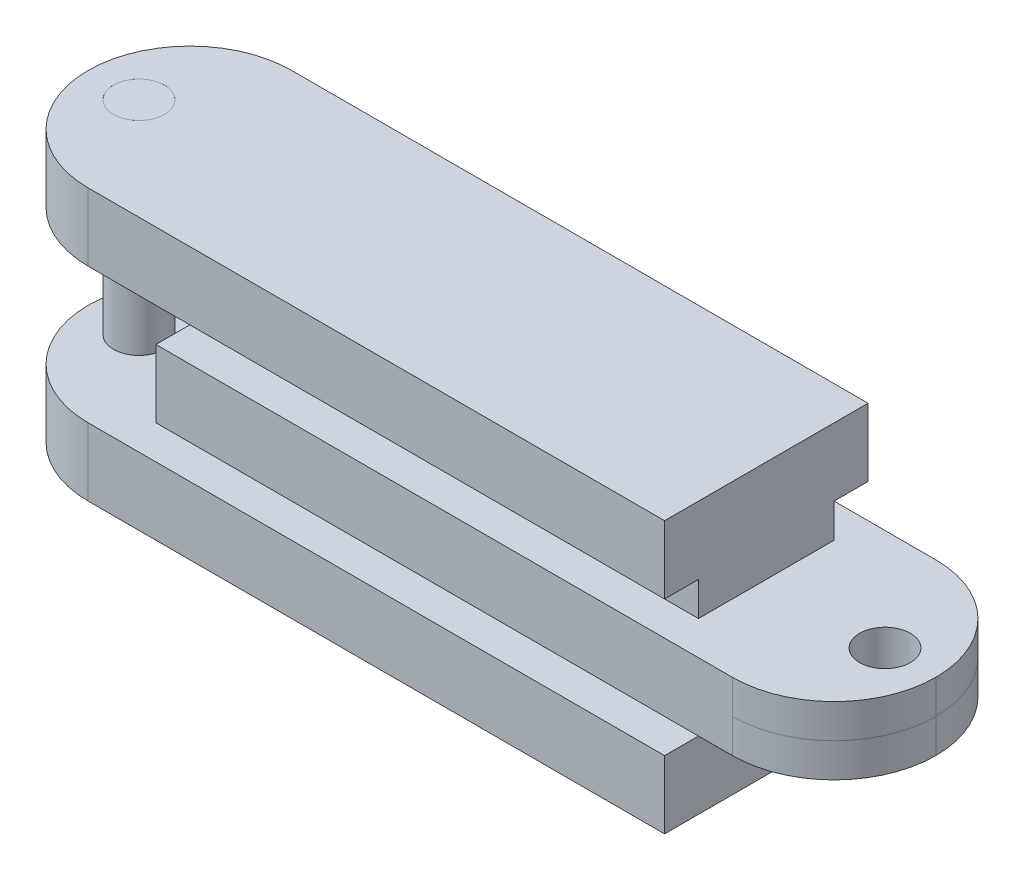
ISO-10303-21;
HEADER;
FILE_DESCRIPTION(('STEP AP214'),'2;1');
FILE_NAME('part.step','',(''),(''),'','','');
FILE_SCHEMA(('AUTOMOTIVE_DESIGN { 1 0 10303 214 1 1 1 1 }'));
ENDSEC;
DATA;
#1=APPLICATION_CONTEXT('core data for automotive mechanical design processes');
#2=APPLICATION_PROTOCOL_DEFINITION('international standard','automotive_design',2000,#1);
#3=PRODUCT_CONTEXT('',#1,'mechanical');
#4=PRODUCT('Part','Part','',(#3));
#5=PRODUCT_RELATED_PRODUCT_CATEGORY('part','',(#4));
#6=PRODUCT_DEFINITION_FORMATION('','',#4);
#7=PRODUCT_DEFINITION_CONTEXT('part definition',#1,'design');
#8=PRODUCT_DEFINITION('design','',#6,#7);
#9=PRODUCT_DEFINITION_SHAPE('','',#8);
#10=(LENGTH_UNIT() NAMED_UNIT(*) SI_UNIT(.MILLI.,.METRE.));
#11=(NAMED_UNIT(*) PLANE_ANGLE_UNIT() SI_UNIT($,.RADIAN.));
#12=(NAMED_UNIT(*) SI_UNIT($,.STERADIAN.) SOLID_ANGLE_UNIT());
#13=UNCERTAINTY_MEASURE_WITH_UNIT(LENGTH_MEASURE(1.E-05),#10,'distance_accuracy_value','');
#14=(GEOMETRIC_REPRESENTATION_CONTEXT(3) GLOBAL_UNCERTAINTY_ASSIGNED_CONTEXT((#13)) GLOBAL_UNIT_ASSIGNED_CONTEXT((#10,
#11,#12)) REPRESENTATION_CONTEXT('',''));
#15=CARTESIAN_POINT('',(0.,0.,0.));
#16=DIRECTION('',(0.,0.,1.));
#17=DIRECTION('',(1.,0.,0.));
#18=AXIS2_PLACEMENT_3D('',#15,#16,#17);
#19=CARTESIAN_POINT('',(-85.,0.,0.));
#20=DIRECTION('',(0.,1.,0.));
#21=DIRECTION('',(-1.,0.,0.));
#22=AXIS2_PLACEMENT_3D('',#19,#20,#21);
#23=CYLINDRICAL_SURFACE('',#22,7.50000000000001);
#24=CARTESIAN_POINT('',(-85.,0.,0.));
#25=DIRECTION('',(0.,1.,0.));
#26=DIRECTION('',(-1.,0.,0.));
#27=AXIS2_PLACEMENT_3D('',#24,#25,#26);
#28=CIRCLE('',#27,7.50000000000001);
#29=CARTESIAN_POINT('',(-92.5,0.,0.));
#30=VERTEX_POINT('',#29);
#31=EDGE_CURVE('E11',#30,#30,#28,.T.);
#32=ORIENTED_EDGE('',*,*,#31,.T.);
#33=EDGE_LOOP('',(#32));
#34=FACE_BOUND('',#33,.T.);
#35=CARTESIAN_POINT('',(-85.,80.,0.));
#36=DIRECTION('',(0.,1.,0.));
#37=DIRECTION('',(-1.,0.,0.));
#38=AXIS2_PLACEMENT_3D('',#35,#36,#37);
#39=CIRCLE('',#38,7.50000000000001);
#40=CARTESIAN_POINT('',(-92.5,80.,0.));
#41=VERTEX_POINT('',#40);
#42=EDGE_CURVE('E52',#41,#41,#39,.T.);
#43=ORIENTED_EDGE('',*,*,#42,.F.);
#44=EDGE_LOOP('',(#43));
#45=FACE_BOUND('',#44,.T.);
#46=ADVANCED_FACE('F46',(#34,#45),#23,.T.);
#47=CARTESIAN_POINT('',(-85.,0.,0.));
#48=DIRECTION('',(0.,1.,0.));
#49=DIRECTION('',(-1.,0.,0.));
#50=AXIS2_PLACEMENT_3D('',#47,#48,#49);
#51=PLANE('',#50);
#52=ORIENTED_EDGE('',*,*,#31,.F.);
#53=EDGE_LOOP('',(#52));
#54=FACE_BOUND('',#53,.T.);
#55=ADVANCED_FACE('F61',(#54),#51,.F.);
#56=CARTESIAN_POINT('',(-85.,80.,0.));
#57=DIRECTION('',(0.,1.,0.));
#58=DIRECTION('',(-1.,0.,0.));
#59=AXIS2_PLACEMENT_3D('',#56,#57,#58);
#60=PLANE('',#59);
#61=ORIENTED_EDGE('',*,*,#42,.T.);
#62=EDGE_LOOP('',(#61));
#63=FACE_BOUND('',#62,.T.);
#64=ADVANCED_FACE('F58',(#63),#60,.T.);
#65=CLOSED_SHELL('',(#46,#55,#64));
#66=MANIFOLD_SOLID_BREP('B2',#65);
#67=CARTESIAN_POINT('',(0.,0.,30.));
#68=DIRECTION('',(0.,0.,-1.));
#69=DIRECTION('',(-1.,0.,0.));
#70=AXIS2_PLACEMENT_3D('',#67,#68,#69);
#71=PLANE('',#70);
#72=DIRECTION('',(0.,-1.,0.));
#73=VECTOR('',#72,1.);
#74=CARTESIAN_POINT('',(-50.,20.,30.));
#75=LINE('',#74,#73);
#76=CARTESIAN_POINT('',(-50.,50.,30.));
#77=VERTEX_POINT('',#76);
#78=CARTESIAN_POINT('',(-50.,30.,30.));
#79=VERTEX_POINT('',#78);
#80=EDGE_CURVE('E411',#77,#79,#75,.T.);
#81=ORIENTED_EDGE('',*,*,#80,.T.);
#82=DIRECTION('',(1.,0.,0.));
#83=VECTOR('',#82,1.);
#84=CARTESIAN_POINT('',(150.,30.,30.));
#85=LINE('',#84,#83);
#86=CARTESIAN_POINT('',(120.,30.,30.));
#87=VERTEX_POINT('',#86);
#88=EDGE_CURVE('E408',#79,#87,#85,.T.);
#89=ORIENTED_EDGE('',*,*,#88,.T.);
#90=DIRECTION('',(0.,1.,0.));
#91=VECTOR('',#90,1.);
#92=CARTESIAN_POINT('',(120.,40.,30.));
#93=LINE('',#92,#91);
#94=CARTESIAN_POINT('',(120.,40.,30.));
#95=VERTEX_POINT('',#94);
#96=EDGE_CURVE('E275',#87,#95,#93,.T.);
#97=ORIENTED_EDGE('',*,*,#96,.T.);
#98=DIRECTION('',(0.,-1.,0.));
#99=VECTOR('',#98,1.);
#100=CARTESIAN_POINT('',(120.,0.,30.));
#101=LINE('',#100,#99);
#102=CARTESIAN_POINT('',(120.,50.,30.));
#103=VERTEX_POINT('',#102);
#104=EDGE_CURVE('E329',#95,#103,#101,.F.);
#105=ORIENTED_EDGE('',*,*,#104,.T.);
#106=DIRECTION('',(1.,0.,0.));
#107=VECTOR('',#106,1.);
#108=CARTESIAN_POINT('',(150.,50.,30.));
#109=LINE('',#108,#107);
#110=EDGE_CURVE('E368',#77,#103,#109,.T.);
#111=ORIENTED_EDGE('',*,*,#110,.F.);
#112=EDGE_LOOP('',(#81,#89,#97,#105,#111));
#113=FACE_BOUND('',#112,.T.);
#114=ADVANCED_FACE('F86',(#113),#71,.F.);
#115=DIRECTION('',(-1.,0.,0.));
#116=VECTOR('',#115,1.);
#117=CARTESIAN_POINT('',(-100.,60.,30.));
#118=LINE('',#117,#116);
#119=CARTESIAN_POINT('',(100.,60.,30.));
#120=VERTEX_POINT('',#119);
#121=CARTESIAN_POINT('',(-70.,60.,30.));
#122=VERTEX_POINT('',#121);
#123=EDGE_CURVE('E356',#120,#122,#118,.T.);
#124=ORIENTED_EDGE('',*,*,#123,.F.);
#125=DIRECTION('',(0.,-1.,0.));
#126=VECTOR('',#125,1.);
#127=CARTESIAN_POINT('',(100.,50.,30.));
#128=LINE('',#127,#126);
#129=CARTESIAN_POINT('',(100.,80.,30.));
#130=VERTEX_POINT('',#129);
#131=EDGE_CURVE('E388',#130,#120,#128,.T.);
#132=ORIENTED_EDGE('',*,*,#131,.F.);
#133=DIRECTION('',(1.,0.,0.));
#134=VECTOR('',#133,1.);
#135=CARTESIAN_POINT('',(100.,80.,30.));
#136=LINE('',#135,#134);
#137=CARTESIAN_POINT('',(-70.,80.,30.));
#138=VERTEX_POINT('',#137);
#139=EDGE_CURVE('E358',#138,#130,#136,.T.);
#140=ORIENTED_EDGE('',*,*,#139,.F.);
#141=DIRECTION('',(0.,1.,0.));
#142=VECTOR('',#141,1.);
#143=CARTESIAN_POINT('',(-70.,0.,30.));
#144=LINE('',#143,#142);
#145=EDGE_CURVE('E94',#138,#122,#144,.F.);
#146=ORIENTED_EDGE('',*,*,#145,.T.);
#147=EDGE_LOOP('',(#124,#132,#140,#146));
#148=FACE_BOUND('',#147,.T.);
#149=ADVANCED_FACE('F354',(#148),#71,.F.);
#150=CARTESIAN_POINT('',(0.,0.,-30.));
#151=DIRECTION('',(0.,0.,-1.));
#152=DIRECTION('',(-1.,0.,0.));
#153=AXIS2_PLACEMENT_3D('',#150,#151,#152);
#154=PLANE('',#153);
#155=DIRECTION('',(0.,-1.,0.));
#156=VECTOR('',#155,1.);
#157=CARTESIAN_POINT('',(-50.,20.,-30.));
#158=LINE('',#157,#156);
#159=CARTESIAN_POINT('',(-50.,50.,-30.));
#160=VERTEX_POINT('',#159);
#161=CARTESIAN_POINT('',(-50.,30.,-30.));
#162=VERTEX_POINT('',#161);
#163=EDGE_CURVE('E424',#160,#162,#158,.T.);
#164=ORIENTED_EDGE('',*,*,#163,.F.);
#165=DIRECTION('',(1.,0.,0.));
#166=VECTOR('',#165,1.);
#167=CARTESIAN_POINT('',(150.,50.,-30.));
#168=LINE('',#167,#166);
#169=CARTESIAN_POINT('',(120.,50.,-30.));
#170=VERTEX_POINT('',#169);
#171=EDGE_CURVE('E383',#160,#170,#168,.T.);
#172=ORIENTED_EDGE('',*,*,#171,.T.);
#173=DIRECTION('',(0.,-1.,0.));
#174=VECTOR('',#173,1.);
#175=CARTESIAN_POINT('',(120.,40.,-30.));
#176=LINE('',#175,#174);
#177=CARTESIAN_POINT('',(120.,40.,-30.));
#178=VERTEX_POINT('',#177);
#179=EDGE_CURVE('E333',#170,#178,#176,.T.);
#180=ORIENTED_EDGE('',*,*,#179,.T.);
#181=DIRECTION('',(0.,1.,0.));
#182=VECTOR('',#181,1.);
#183=CARTESIAN_POINT('',(120.,0.,-30.));
#184=LINE('',#183,#182);
#185=CARTESIAN_POINT('',(120.,30.,-30.));
#186=VERTEX_POINT('',#185);
#187=EDGE_CURVE('E303',#178,#186,#184,.F.);
#188=ORIENTED_EDGE('',*,*,#187,.T.);
#189=DIRECTION('',(1.,0.,0.));
#190=VECTOR('',#189,1.);
#191=CARTESIAN_POINT('',(150.,30.,-30.));
#192=LINE('',#191,#190);
#193=EDGE_CURVE('E422',#162,#186,#192,.T.);
#194=ORIENTED_EDGE('',*,*,#193,.F.);
#195=EDGE_LOOP('',(#164,#172,#180,#188,#194));
#196=FACE_BOUND('',#195,.T.);
#197=ADVANCED_FACE('F531',(#196),#154,.T.);
#198=DIRECTION('',(-1.,0.,0.));
#199=VECTOR('',#198,1.);
#200=CARTESIAN_POINT('',(-100.,20.,-30.));
#201=LINE('',#200,#199);
#202=CARTESIAN_POINT('',(100.,20.,-30.));
#203=VERTEX_POINT('',#202);
#204=CARTESIAN_POINT('',(-70.,20.,-30.));
#205=VERTEX_POINT('',#204);
#206=EDGE_CURVE('E285',#203,#205,#201,.T.);
#207=ORIENTED_EDGE('',*,*,#206,.F.);
#208=DIRECTION('',(0.,1.,0.));
#209=VECTOR('',#208,1.);
#210=CARTESIAN_POINT('',(100.,30.,-30.));
#211=LINE('',#210,#209);
#212=CARTESIAN_POINT('',(100.,0.,-30.));
#213=VERTEX_POINT('',#212);
#214=EDGE_CURVE('E419',#213,#203,#211,.T.);
#215=ORIENTED_EDGE('',*,*,#214,.F.);
#216=DIRECTION('',(1.,0.,0.));
#217=VECTOR('',#216,1.);
#218=CARTESIAN_POINT('',(100.,0.,-30.));
#219=LINE('',#218,#217);
#220=CARTESIAN_POINT('',(-70.,0.,-30.));
#221=VERTEX_POINT('',#220);
#222=EDGE_CURVE('E417',#221,#213,#219,.T.);
#223=ORIENTED_EDGE('',*,*,#222,.F.);
#224=DIRECTION('',(0.,-1.,0.));
#225=VECTOR('',#224,1.);
#226=CARTESIAN_POINT('',(-70.,0.,-30.));
#227=LINE('',#226,#225);
#228=EDGE_CURVE('E315',#221,#205,#227,.F.);
#229=ORIENTED_EDGE('',*,*,#228,.T.);
#230=EDGE_LOOP('',(#207,#215,#223,#229));
#231=FACE_BOUND('',#230,.T.);
#232=ADVANCED_FACE('F544',(#231),#154,.T.);
#233=CARTESIAN_POINT('',(100.,0.,-30.));
#234=DIRECTION('',(0.,-1.,0.));
#235=DIRECTION('',(1.,0.,0.));
#236=AXIS2_PLACEMENT_3D('',#233,#234,#235);
#237=PLANE('',#236);
#238=CARTESIAN_POINT('',(-85.,0.,0.));
#239=DIRECTION('',(0.,1.,0.));
#240=DIRECTION('',(0.,0.,1.));
#241=AXIS2_PLACEMENT_3D('',#238,#239,#240);
#242=CIRCLE('',#241,7.50000000000001);
#243=CARTESIAN_POINT('',(-85.,0.,7.50000000000001));
#244=VERTEX_POINT('',#243);
#245=EDGE_CURVE('E310',#244,#244,#242,.T.);
#246=ORIENTED_EDGE('',*,*,#245,.T.);
#247=EDGE_LOOP('',(#246));
#248=FACE_BOUND('',#247,.T.);
#249=DIRECTION('',(1.,0.,0.));
#250=VECTOR('',#249,1.);
#251=CARTESIAN_POINT('',(100.,0.,30.));
#252=LINE('',#251,#250);
#253=CARTESIAN_POINT('',(-70.,0.,30.));
#254=VERTEX_POINT('',#253);
#255=CARTESIAN_POINT('',(100.,0.,30.));
#256=VERTEX_POINT('',#255);
#257=EDGE_CURVE('E292',#254,#256,#252,.T.);
#258=ORIENTED_EDGE('',*,*,#257,.F.);
#259=CARTESIAN_POINT('',(-70.,0.,0.));
#260=DIRECTION('',(0.,-1.,0.));
#261=DIRECTION('',(1.,0.,0.));
#262=AXIS2_PLACEMENT_3D('',#259,#260,#261);
#263=CIRCLE('',#262,30.);
#264=CARTESIAN_POINT('',(-100.,0.,0.));
#265=VERTEX_POINT('',#264);
#266=EDGE_CURVE('E322',#254,#265,#263,.T.);
#267=ORIENTED_EDGE('',*,*,#266,.T.);
#268=CARTESIAN_POINT('',(-70.,0.,0.));
#269=DIRECTION('',(0.,-1.,0.));
#270=DIRECTION('',(1.,0.,0.));
#271=AXIS2_PLACEMENT_3D('',#268,#269,#270);
#272=CIRCLE('',#271,30.);
#273=EDGE_CURVE('E313',#265,#221,#272,.T.);
#274=ORIENTED_EDGE('',*,*,#273,.T.);
#275=ORIENTED_EDGE('',*,*,#222,.T.);
#276=DIRECTION('',(0.,0.,1.));
#277=VECTOR('',#276,1.);
#278=CARTESIAN_POINT('',(100.,0.,-30.));
#279=LINE('',#278,#277);
#280=EDGE_CURVE('E282',#213,#256,#279,.T.);
#281=ORIENTED_EDGE('',*,*,#280,.T.);
#282=EDGE_LOOP('',(#258,#267,#274,#275,#281));
#283=FACE_BOUND('',#282,.T.);
#284=ADVANCED_FACE('F554',(#248,#283),#237,.T.);
#285=CARTESIAN_POINT('',(-100.,20.,-30.));
#286=DIRECTION('',(0.,1.,0.));
#287=DIRECTION('',(-1.,0.,0.));
#288=AXIS2_PLACEMENT_3D('',#285,#286,#287);
#289=PLANE('',#288);
#290=CARTESIAN_POINT('',(-85.,20.,0.));
#291=DIRECTION('',(0.,1.,0.));
#292=DIRECTION('',(-1.,0.,0.));
#293=AXIS2_PLACEMENT_3D('',#290,#291,#292);
#294=CIRCLE('',#293,7.50000000000001);
#295=CARTESIAN_POINT('',(-92.5,20.,0.));
#296=VERTEX_POINT('',#295);
#297=EDGE_CURVE('E293',#296,#296,#294,.T.);
#298=ORIENTED_EDGE('',*,*,#297,.F.);
#299=EDGE_LOOP('',(#298));
#300=FACE_BOUND('',#299,.T.);
#301=CARTESIAN_POINT('',(-70.,20.,0.));
#302=DIRECTION('',(0.,1.,0.));
#303=DIRECTION('',(-1.,0.,0.));
#304=AXIS2_PLACEMENT_3D('',#301,#302,#303);
#305=CIRCLE('',#304,30.);
#306=CARTESIAN_POINT('',(-100.,20.,0.));
#307=VERTEX_POINT('',#306);
#308=EDGE_CURVE('E317',#205,#307,#305,.T.);
#309=ORIENTED_EDGE('',*,*,#308,.T.);
#310=CARTESIAN_POINT('',(-70.,20.,0.));
#311=DIRECTION('',(0.,1.,0.));
#312=DIRECTION('',(-1.,0.,0.));
#313=AXIS2_PLACEMENT_3D('',#310,#311,#312);
#314=CIRCLE('',#313,30.);
#315=CARTESIAN_POINT('',(-70.,20.,30.));
#316=VERTEX_POINT('',#315);
#317=EDGE_CURVE('E324',#307,#316,#314,.T.);
#318=ORIENTED_EDGE('',*,*,#317,.T.);
#319=DIRECTION('',(-1.,0.,0.));
#320=VECTOR('',#319,1.);
#321=CARTESIAN_POINT('',(-100.,20.,30.));
#322=LINE('',#321,#320);
#323=CARTESIAN_POINT('',(100.,20.,30.));
#324=VERTEX_POINT('',#323);
#325=EDGE_CURVE('E414',#324,#316,#322,.T.);
#326=ORIENTED_EDGE('',*,*,#325,.F.);
#327=DIRECTION('',(0.,0.,1.));
#328=VECTOR('',#327,1.);
#329=CARTESIAN_POINT('',(100.,20.,20.));
#330=LINE('',#329,#328);
#331=CARTESIAN_POINT('',(100.,20.,20.));
#332=VERTEX_POINT('',#331);
#333=EDGE_CURVE('E256',#332,#324,#330,.T.);
#334=ORIENTED_EDGE('',*,*,#333,.F.);
#335=DIRECTION('',(1.,0.,0.));
#336=VECTOR('',#335,1.);
#337=CARTESIAN_POINT('',(-50.,20.,20.));
#338=LINE('',#337,#336);
#339=CARTESIAN_POINT('',(-50.,20.,20.));
#340=VERTEX_POINT('',#339);
#341=EDGE_CURVE('E249',#340,#332,#338,.T.);
#342=ORIENTED_EDGE('',*,*,#341,.F.);
#343=DIRECTION('',(0.,0.,1.));
#344=VECTOR('',#343,1.);
#345=CARTESIAN_POINT('',(-50.,20.,-30.));
#346=LINE('',#345,#344);
#347=CARTESIAN_POINT('',(-50.,20.,-20.));
#348=VERTEX_POINT('',#347);
#349=EDGE_CURVE('E254',#348,#340,#346,.T.);
#350=ORIENTED_EDGE('',*,*,#349,.F.);
#351=DIRECTION('',(-1.,0.,0.));
#352=VECTOR('',#351,1.);
#353=CARTESIAN_POINT('',(-50.,20.,-20.));
#354=LINE('',#353,#352);
#355=CARTESIAN_POINT('',(100.,20.,-20.));
#356=VERTEX_POINT('',#355);
#357=EDGE_CURVE('E484',#356,#348,#354,.T.);
#358=ORIENTED_EDGE('',*,*,#357,.F.);
#359=DIRECTION('',(0.,0.,-1.));
#360=VECTOR('',#359,1.);
#361=CARTESIAN_POINT('',(100.,20.,-20.));
#362=LINE('',#361,#360);
#363=EDGE_CURVE('E433',#356,#203,#362,.T.);
#364=ORIENTED_EDGE('',*,*,#363,.T.);
#365=ORIENTED_EDGE('',*,*,#206,.T.);
#366=EDGE_LOOP('',(#309,#318,#326,#334,#342,#350,#358,#364,#365));
#367=FACE_BOUND('',#366,.T.);
#368=ADVANCED_FACE('F251',(#300,#367),#289,.T.);
#369=CARTESIAN_POINT('',(-50.,20.,-30.));
#370=DIRECTION('',(-1.,0.,0.));
#371=DIRECTION('',(0.,0.,1.));
#372=AXIS2_PLACEMENT_3D('',#369,#370,#371);
#373=PLANE('',#372);
#374=DIRECTION('',(0.,0.,1.));
#375=VECTOR('',#374,1.);
#376=CARTESIAN_POINT('',(-50.,30.,20.));
#377=LINE('',#376,#375);
#378=CARTESIAN_POINT('',(-50.,30.,20.));
#379=VERTEX_POINT('',#378);
#380=EDGE_CURVE('E451',#379,#79,#377,.T.);
#381=ORIENTED_EDGE('',*,*,#380,.T.);
#382=ORIENTED_EDGE('',*,*,#80,.F.);
#383=DIRECTION('',(0.,0.,1.));
#384=VECTOR('',#383,1.);
#385=CARTESIAN_POINT('',(-50.,50.,20.));
#386=LINE('',#385,#384);
#387=CARTESIAN_POINT('',(-50.,50.,20.));
#388=VERTEX_POINT('',#387);
#389=EDGE_CURVE('E463',#388,#77,#386,.T.);
#390=ORIENTED_EDGE('',*,*,#389,.F.);
#391=DIRECTION('',(0.,-1.,0.));
#392=VECTOR('',#391,1.);
#393=CARTESIAN_POINT('',(-50.,60.,20.));
#394=LINE('',#393,#392);
#395=CARTESIAN_POINT('',(-50.,60.,20.));
#396=VERTEX_POINT('',#395);
#397=EDGE_CURVE('E453',#396,#388,#394,.T.);
#398=ORIENTED_EDGE('',*,*,#397,.F.);
#399=DIRECTION('',(0.,0.,1.));
#400=VECTOR('',#399,1.);
#401=CARTESIAN_POINT('',(-50.,60.,-30.));
#402=LINE('',#401,#400);
#403=CARTESIAN_POINT('',(-50.,60.,-20.));
#404=VERTEX_POINT('',#403);
#405=EDGE_CURVE('E393',#404,#396,#402,.T.);
#406=ORIENTED_EDGE('',*,*,#405,.F.);
#407=DIRECTION('',(0.,1.,0.));
#408=VECTOR('',#407,1.);
#409=CARTESIAN_POINT('',(-50.,60.,-20.));
#410=LINE('',#409,#408);
#411=CARTESIAN_POINT('',(-50.,50.,-20.));
#412=VERTEX_POINT('',#411);
#413=EDGE_CURVE('E465',#412,#404,#410,.T.);
#414=ORIENTED_EDGE('',*,*,#413,.F.);
#415=DIRECTION('',(0.,0.,-1.));
#416=VECTOR('',#415,1.);
#417=CARTESIAN_POINT('',(-50.,50.,-20.));
#418=LINE('',#417,#416);
#419=EDGE_CURVE('E476',#412,#160,#418,.T.);
#420=ORIENTED_EDGE('',*,*,#419,.T.);
#421=ORIENTED_EDGE('',*,*,#163,.T.);
#422=DIRECTION('',(0.,0.,-1.));
#423=VECTOR('',#422,1.);
#424=CARTESIAN_POINT('',(-50.,30.,-20.));
#425=LINE('',#424,#423);
#426=CARTESIAN_POINT('',(-50.,30.,-20.));
#427=VERTEX_POINT('',#426);
#428=EDGE_CURVE('E486',#427,#162,#425,.T.);
#429=ORIENTED_EDGE('',*,*,#428,.F.);
#430=DIRECTION('',(0.,1.,0.));
#431=VECTOR('',#430,1.);
#432=CARTESIAN_POINT('',(-50.,20.,-20.));
#433=LINE('',#432,#431);
#434=EDGE_CURVE('E274',#348,#427,#433,.T.);
#435=ORIENTED_EDGE('',*,*,#434,.F.);
#436=ORIENTED_EDGE('',*,*,#349,.T.);
#437=DIRECTION('',(0.,-1.,0.));
#438=VECTOR('',#437,1.);
#439=CARTESIAN_POINT('',(-50.,20.,20.));
#440=LINE('',#439,#438);
#441=EDGE_CURVE('E260',#379,#340,#440,.T.);
#442=ORIENTED_EDGE('',*,*,#441,.F.);
#443=EDGE_LOOP('',(#381,#382,#390,#398,#406,#414,#420,#421,#429,#435,#436,#442));
#444=FACE_BOUND('',#443,.T.);
#445=ADVANCED_FACE('F271',(#444),#373,.T.);
#446=CARTESIAN_POINT('',(150.,30.,-30.));
#447=DIRECTION('',(0.,-1.,0.));
#448=DIRECTION('',(1.,0.,0.));
#449=AXIS2_PLACEMENT_3D('',#446,#447,#448);
#450=PLANE('',#449);
#451=CARTESIAN_POINT('',(135.,30.,0.));
#452=DIRECTION('',(0.,-1.,0.));
#453=DIRECTION('',(1.,0.,0.));
#454=AXIS2_PLACEMENT_3D('',#451,#452,#453);
#455=CIRCLE('',#454,7.50000000000001);
#456=CARTESIAN_POINT('',(127.5,30.,0.));
#457=VERTEX_POINT('',#456);
#458=EDGE_CURVE('E290',#457,#457,#455,.T.);
#459=ORIENTED_EDGE('',*,*,#458,.F.);
#460=EDGE_LOOP('',(#459));
#461=FACE_BOUND('',#460,.T.);
#462=ORIENTED_EDGE('',*,*,#193,.T.);
#463=CARTESIAN_POINT('',(120.,30.,0.));
#464=DIRECTION('',(0.,-1.,0.));
#465=DIRECTION('',(1.,0.,0.));
#466=AXIS2_PLACEMENT_3D('',#463,#464,#465);
#467=CIRCLE('',#466,30.);
#468=CARTESIAN_POINT('',(150.,30.,0.));
#469=VERTEX_POINT('',#468);
#470=EDGE_CURVE('E305',#186,#469,#467,.T.);
#471=ORIENTED_EDGE('',*,*,#470,.T.);
#472=CARTESIAN_POINT('',(120.,30.,0.));
#473=DIRECTION('',(0.,-1.,0.));
#474=DIRECTION('',(1.,0.,0.));
#475=AXIS2_PLACEMENT_3D('',#472,#473,#474);
#476=CIRCLE('',#475,30.);
#477=EDGE_CURVE('E299',#469,#87,#476,.T.);
#478=ORIENTED_EDGE('',*,*,#477,.T.);
#479=ORIENTED_EDGE('',*,*,#88,.F.);
#480=ORIENTED_EDGE('',*,*,#380,.F.);
#481=DIRECTION('',(-1.,0.,0.));
#482=VECTOR('',#481,1.);
#483=CARTESIAN_POINT('',(-50.,30.,20.));
#484=LINE('',#483,#482);
#485=CARTESIAN_POINT('',(100.,30.,20.));
#486=VERTEX_POINT('',#485);
#487=EDGE_CURVE('E266',#486,#379,#484,.T.);
#488=ORIENTED_EDGE('',*,*,#487,.F.);
#489=DIRECTION('',(0.,0.,1.));
#490=VECTOR('',#489,1.);
#491=CARTESIAN_POINT('',(100.,30.,-30.));
#492=LINE('',#491,#490);
#493=CARTESIAN_POINT('',(100.,30.,-20.));
#494=VERTEX_POINT('',#493);
#495=EDGE_CURVE('E276',#494,#486,#492,.T.);
#496=ORIENTED_EDGE('',*,*,#495,.F.);
#497=DIRECTION('',(1.,0.,0.));
#498=VECTOR('',#497,1.);
#499=CARTESIAN_POINT('',(-50.,30.,-20.));
#500=LINE('',#499,#498);
#501=EDGE_CURVE('E480',#427,#494,#500,.T.);
#502=ORIENTED_EDGE('',*,*,#501,.F.);
#503=ORIENTED_EDGE('',*,*,#428,.T.);
#504=EDGE_LOOP('',(#462,#471,#478,#479,#480,#488,#496,#502,#503));
#505=FACE_BOUND('',#504,.T.);
#506=ADVANCED_FACE('F549',(#461,#505),#450,.T.);
#507=CARTESIAN_POINT('',(100.,30.,-30.));
#508=DIRECTION('',(1.,0.,0.));
#509=DIRECTION('',(0.,0.,-1.));
#510=AXIS2_PLACEMENT_3D('',#507,#508,#509);
#511=PLANE('',#510);
#512=ORIENTED_EDGE('',*,*,#333,.T.);
#513=DIRECTION('',(0.,1.,0.));
#514=VECTOR('',#513,1.);
#515=CARTESIAN_POINT('',(100.,30.,30.));
#516=LINE('',#515,#514);
#517=EDGE_CURVE('E405',#256,#324,#516,.T.);
#518=ORIENTED_EDGE('',*,*,#517,.F.);
#519=ORIENTED_EDGE('',*,*,#280,.F.);
#520=ORIENTED_EDGE('',*,*,#214,.T.);
#521=ORIENTED_EDGE('',*,*,#363,.F.);
#522=DIRECTION('',(0.,-1.,0.));
#523=VECTOR('',#522,1.);
#524=CARTESIAN_POINT('',(100.,20.,-20.));
#525=LINE('',#524,#523);
#526=EDGE_CURVE('E482',#494,#356,#525,.T.);
#527=ORIENTED_EDGE('',*,*,#526,.F.);
#528=ORIENTED_EDGE('',*,*,#495,.T.);
#529=DIRECTION('',(0.,1.,0.));
#530=VECTOR('',#529,1.);
#531=CARTESIAN_POINT('',(100.,20.,20.));
#532=LINE('',#531,#530);
#533=EDGE_CURVE('E259',#332,#486,#532,.T.);
#534=ORIENTED_EDGE('',*,*,#533,.F.);
#535=EDGE_LOOP('',(#512,#518,#519,#520,#521,#527,#528,#534));
#536=FACE_BOUND('',#535,.T.);
#537=ADVANCED_FACE('F450',(#536),#511,.T.);
#538=DIRECTION('',(0.,-1.,0.));
#539=VECTOR('',#538,1.);
#540=CARTESIAN_POINT('',(100.,50.,-30.));
#541=LINE('',#540,#539);
#542=CARTESIAN_POINT('',(100.,80.,-30.));
#543=VERTEX_POINT('',#542);
#544=CARTESIAN_POINT('',(100.,60.,-30.));
#545=VERTEX_POINT('',#544);
#546=EDGE_CURVE('E382',#543,#545,#541,.T.);
#547=ORIENTED_EDGE('',*,*,#546,.T.);
#548=DIRECTION('',(-1.,0.,0.));
#549=VECTOR('',#548,1.);
#550=CARTESIAN_POINT('',(-100.,60.,-30.));
#551=LINE('',#550,#549);
#552=CARTESIAN_POINT('',(-70.,60.,-30.));
#553=VERTEX_POINT('',#552);
#554=EDGE_CURVE('E375',#545,#553,#551,.T.);
#555=ORIENTED_EDGE('',*,*,#554,.T.);
#556=DIRECTION('',(0.,1.,0.));
#557=VECTOR('',#556,1.);
#558=CARTESIAN_POINT('',(-70.,80.,-30.));
#559=LINE('',#558,#557);
#560=CARTESIAN_POINT('',(-70.,80.,-30.));
#561=VERTEX_POINT('',#560);
#562=EDGE_CURVE('E338',#553,#561,#559,.T.);
#563=ORIENTED_EDGE('',*,*,#562,.T.);
#564=DIRECTION('',(1.,0.,0.));
#565=VECTOR('',#564,1.);
#566=CARTESIAN_POINT('',(100.,80.,-30.));
#567=LINE('',#566,#565);
#568=EDGE_CURVE('E384',#561,#543,#567,.T.);
#569=ORIENTED_EDGE('',*,*,#568,.T.);
#570=EDGE_LOOP('',(#547,#555,#563,#569));
#571=FACE_BOUND('',#570,.T.);
#572=ADVANCED_FACE('F379',(#571),#154,.T.);
#573=ORIENTED_EDGE('',*,*,#517,.T.);
#574=ORIENTED_EDGE('',*,*,#325,.T.);
#575=DIRECTION('',(0.,-1.,0.));
#576=VECTOR('',#575,1.);
#577=CARTESIAN_POINT('',(-70.,0.,30.));
#578=LINE('',#577,#576);
#579=EDGE_CURVE('E319',#316,#254,#578,.T.);
#580=ORIENTED_EDGE('',*,*,#579,.T.);
#581=ORIENTED_EDGE('',*,*,#257,.T.);
#582=EDGE_LOOP('',(#573,#574,#580,#581));
#583=FACE_BOUND('',#582,.T.);
#584=ADVANCED_FACE('F445',(#583),#71,.F.);
#585=CARTESIAN_POINT('',(135.,0.,0.));
#586=DIRECTION('',(0.,1.,0.));
#587=DIRECTION('',(-1.,0.,0.));
#588=AXIS2_PLACEMENT_3D('',#585,#586,#587);
#589=CYLINDRICAL_SURFACE('',#588,7.50000000000001);
#590=CARTESIAN_POINT('',(135.,50.,0.));
#591=DIRECTION('',(0.,-1.,0.));
#592=DIRECTION('',(1.,0.,0.));
#593=AXIS2_PLACEMENT_3D('',#590,#591,#592);
#594=CIRCLE('',#593,7.50000000000001);
#595=CARTESIAN_POINT('',(127.5,50.,0.));
#596=VERTEX_POINT('',#595);
#597=EDGE_CURVE('E496',#596,#596,#594,.F.);
#598=CARTESIAN_POINT('',(127.5,30.,0.));
#599=CARTESIAN_POINT('',(127.5,30.2083333333333,0.));
#600=CARTESIAN_POINT('',(127.5,30.4166666666667,0.));
#601=CARTESIAN_POINT('',(127.5,30.8333333333333,0.));
#602=CARTESIAN_POINT('',(127.5,31.0416666666667,0.));
#603=CARTESIAN_POINT('',(127.5,31.4583333333333,0.));
#604=CARTESIAN_POINT('',(127.5,31.6666666666667,0.));
#605=CARTESIAN_POINT('',(127.5,32.0833333333333,0.));
#606=CARTESIAN_POINT('',(127.5,32.2916666666667,0.));
#607=CARTESIAN_POINT('',(127.5,32.7083333333333,0.));
#608=CARTESIAN_POINT('',(127.5,32.9166666666667,0.));
#609=CARTESIAN_POINT('',(127.5,33.3333333333333,0.));
#610=CARTESIAN_POINT('',(127.5,33.5416666666667,0.));
#611=CARTESIAN_POINT('',(127.5,33.9583333333333,0.));
#612=CARTESIAN_POINT('',(127.5,34.1666666666667,0.));
#613=CARTESIAN_POINT('',(127.5,34.5833333333333,0.));
#614=CARTESIAN_POINT('',(127.5,34.7916666666667,0.));
#615=CARTESIAN_POINT('',(127.5,35.2083333333333,0.));
#616=CARTESIAN_POINT('',(127.5,35.4166666666667,0.));
#617=CARTESIAN_POINT('',(127.5,35.8333333333333,0.));
#618=CARTESIAN_POINT('',(127.5,36.0416666666667,0.));
#619=CARTESIAN_POINT('',(127.5,36.4583333333333,0.));
#620=CARTESIAN_POINT('',(127.5,36.6666666666667,0.));
#621=CARTESIAN_POINT('',(127.5,37.0833333333333,0.));
#622=CARTESIAN_POINT('',(127.5,37.2916666666667,0.));
#623=CARTESIAN_POINT('',(127.5,37.7083333333333,0.));
#624=CARTESIAN_POINT('',(127.5,37.9166666666667,0.));
#625=CARTESIAN_POINT('',(127.5,38.3333333333333,0.));
#626=CARTESIAN_POINT('',(127.5,38.5416666666667,0.));
#627=CARTESIAN_POINT('',(127.5,38.9583333333333,0.));
#628=CARTESIAN_POINT('',(127.5,39.1666666666667,0.));
#629=CARTESIAN_POINT('',(127.5,39.5833333333333,0.));
#630=CARTESIAN_POINT('',(127.5,39.7916666666667,0.));
#631=CARTESIAN_POINT('',(127.5,40.2083333333333,0.));
#632=CARTESIAN_POINT('',(127.5,40.4166666666667,0.));
#633=CARTESIAN_POINT('',(127.5,40.8333333333333,0.));
#634=CARTESIAN_POINT('',(127.5,41.0416666666667,0.));
#635=CARTESIAN_POINT('',(127.5,41.4583333333333,0.));
#636=CARTESIAN_POINT('',(127.5,41.6666666666667,0.));
#637=CARTESIAN_POINT('',(127.5,42.0833333333333,0.));
#638=CARTESIAN_POINT('',(127.5,42.2916666666667,0.));
#639=CARTESIAN_POINT('',(127.5,42.7083333333333,0.));
#640=CARTESIAN_POINT('',(127.5,42.9166666666667,0.));
#641=CARTESIAN_POINT('',(127.5,43.3333333333333,0.));
#642=CARTESIAN_POINT('',(127.5,43.5416666666667,0.));
#643=CARTESIAN_POINT('',(127.5,43.9583333333333,0.));
#644=CARTESIAN_POINT('',(127.5,44.1666666666667,0.));
#645=CARTESIAN_POINT('',(127.5,44.5833333333333,0.));
#646=CARTESIAN_POINT('',(127.5,44.7916666666667,0.));
#647=CARTESIAN_POINT('',(127.5,45.2083333333333,0.));
#648=CARTESIAN_POINT('',(127.5,45.4166666666667,0.));
#649=CARTESIAN_POINT('',(127.5,45.8333333333333,0.));
#650=CARTESIAN_POINT('',(127.5,46.0416666666667,0.));
#651=CARTESIAN_POINT('',(127.5,46.4583333333333,0.));
#652=CARTESIAN_POINT('',(127.5,46.6666666666667,0.));
#653=CARTESIAN_POINT('',(127.5,47.0833333333333,0.));
#654=CARTESIAN_POINT('',(127.5,47.2916666666667,0.));
#655=CARTESIAN_POINT('',(127.5,47.7083333333333,0.));
#656=CARTESIAN_POINT('',(127.5,47.9166666666667,0.));
#657=CARTESIAN_POINT('',(127.5,48.3333333333333,0.));
#658=CARTESIAN_POINT('',(127.5,48.5416666666667,0.));
#659=CARTESIAN_POINT('',(127.5,48.9583333333333,0.));
#660=CARTESIAN_POINT('',(127.5,49.1666666666667,0.));
#661=CARTESIAN_POINT('',(127.5,49.5833333333333,0.));
#662=CARTESIAN_POINT('',(127.5,49.7916666666667,0.));
#663=CARTESIAN_POINT('',(127.5,50.,0.));
#664=B_SPLINE_CURVE_WITH_KNOTS('',3,(#598,#599,#600,#601,#602,#603,#604,#605,#606,#607,#608,
#609,#610,#611,#612,#613,#614,#615,#616,#617,#618,#619,#620,#621,#622,#623,#624,#625,#626,#627,
#628,#629,#630,#631,#632,#633,#634,#635,#636,#637,#638,#639,#640,#641,#642,#643,#644,#645,#646,
#647,#648,#649,#650,#651,#652,#653,#654,#655,#656,#657,#658,#659,#660,#661,#662,#663),
.UNSPECIFIED.,.F.,.F.,(4,2,2,2,2,2,2,2,2,2,2,2,2,2,2,2,2,2,2,2,2,2,2,2,2,2,2,2,2,2,2,2,4),(0.,
0.625000000000001,1.25,1.875,2.5,3.12499999999999,3.74999999999999,4.37499999999999,
4.99999999999999,5.62499999999999,6.25,6.875,7.5,8.125,8.75,9.375,10.,10.625,11.25,11.875,12.5,
13.125,13.75,14.375,15.,15.625,16.25,16.875,17.5,18.125,18.75,19.375,20.),.UNSPECIFIED.);
#665=EDGE_CURVE('BSEAM535',#457,#596,#664,.T.);
#666=ORIENTED_EDGE('',*,*,#458,.T.);
#667=ORIENTED_EDGE('',*,*,#597,.T.);
#668=ORIENTED_EDGE('',*,*,#665,.T.);
#669=ORIENTED_EDGE('',*,*,#665,.F.);
#670=EDGE_LOOP('',(#666,#668,#667,#669));
#671=FACE_BOUND('',#670,.T.);
#672=ADVANCED_FACE('F535',(#671),#589,.F.);
#673=CARTESIAN_POINT('',(120.,0.,0.));
#674=DIRECTION('',(0.,-1.,0.));
#675=DIRECTION('',(0.,0.,-1.));
#676=AXIS2_PLACEMENT_3D('',#673,#674,#675);
#677=CYLINDRICAL_SURFACE('',#676,30.);
#678=ORIENTED_EDGE('',*,*,#477,.F.);
#679=DIRECTION('',(0.,1.,0.));
#680=VECTOR('',#679,1.);
#681=CARTESIAN_POINT('',(150.,30.,0.));
#682=LINE('',#681,#680);
#683=CARTESIAN_POINT('',(150.,40.,0.));
#684=VERTEX_POINT('',#683);
#685=EDGE_CURVE('E296',#684,#469,#682,.F.);
#686=ORIENTED_EDGE('',*,*,#685,.F.);
#687=CARTESIAN_POINT('',(120.,40.,0.));
#688=DIRECTION('',(0.,1.,0.));
#689=DIRECTION('',(-1.,0.,0.));
#690=AXIS2_PLACEMENT_3D('',#687,#688,#689);
#691=CIRCLE('',#690,30.);
#692=EDGE_CURVE('E279',#95,#684,#691,.T.);
#693=ORIENTED_EDGE('',*,*,#692,.F.);
#694=ORIENTED_EDGE('',*,*,#96,.F.);
#695=EDGE_LOOP('',(#678,#686,#693,#694));
#696=FACE_BOUND('',#695,.T.);
#697=ADVANCED_FACE('F541',(#696),#677,.T.);
#698=CARTESIAN_POINT('',(120.,40.,0.));
#699=DIRECTION('',(0.,1.,0.));
#700=DIRECTION('',(0.,0.,1.));
#701=AXIS2_PLACEMENT_3D('',#698,#699,#700);
#702=CYLINDRICAL_SURFACE('',#701,30.);
#703=ORIENTED_EDGE('',*,*,#470,.F.);
#704=ORIENTED_EDGE('',*,*,#187,.F.);
#705=CARTESIAN_POINT('',(120.,40.,0.));
#706=DIRECTION('',(0.,1.,0.));
#707=DIRECTION('',(-1.,0.,0.));
#708=AXIS2_PLACEMENT_3D('',#705,#706,#707);
#709=CIRCLE('',#708,30.);
#710=EDGE_CURVE('E301',#684,#178,#709,.T.);
#711=ORIENTED_EDGE('',*,*,#710,.F.);
#712=ORIENTED_EDGE('',*,*,#685,.T.);
#713=EDGE_LOOP('',(#703,#704,#711,#712));
#714=FACE_BOUND('',#713,.T.);
#715=ADVANCED_FACE('F572',(#714),#702,.T.);
#716=CARTESIAN_POINT('',(-85.,0.,0.));
#717=DIRECTION('',(0.,1.,0.));
#718=DIRECTION('',(0.,0.,1.));
#719=AXIS2_PLACEMENT_3D('',#716,#717,#718);
#720=CYLINDRICAL_SURFACE('',#719,7.50000000000001);
#721=ORIENTED_EDGE('',*,*,#297,.T.);
#722=EDGE_LOOP('',(#721));
#723=FACE_BOUND('',#722,.T.);
#724=ORIENTED_EDGE('',*,*,#245,.F.);
#725=EDGE_LOOP('',(#724));
#726=FACE_BOUND('',#725,.T.);
#727=ADVANCED_FACE('F576',(#723,#726),#720,.F.);
#728=CARTESIAN_POINT('',(-70.,0.,0.));
#729=DIRECTION('',(0.,-1.,0.));
#730=DIRECTION('',(0.,0.,-1.));
#731=AXIS2_PLACEMENT_3D('',#728,#729,#730);
#732=CYLINDRICAL_SURFACE('',#731,30.);
#733=ORIENTED_EDGE('',*,*,#308,.F.);
#734=ORIENTED_EDGE('',*,*,#228,.F.);
#735=ORIENTED_EDGE('',*,*,#273,.F.);
#736=DIRECTION('',(0.,-1.,0.));
#737=VECTOR('',#736,1.);
#738=CARTESIAN_POINT('',(-100.,0.,0.));
#739=LINE('',#738,#737);
#740=EDGE_CURVE('E307',#307,#265,#739,.T.);
#741=ORIENTED_EDGE('',*,*,#740,.F.);
#742=EDGE_LOOP('',(#733,#734,#735,#741));
#743=FACE_BOUND('',#742,.T.);
#744=ADVANCED_FACE('F438',(#743),#732,.T.);
#745=CARTESIAN_POINT('',(-70.,0.,0.));
#746=DIRECTION('',(0.,1.,0.));
#747=DIRECTION('',(0.,0.,1.));
#748=AXIS2_PLACEMENT_3D('',#745,#746,#747);
#749=CYLINDRICAL_SURFACE('',#748,30.);
#750=ORIENTED_EDGE('',*,*,#317,.F.);
#751=ORIENTED_EDGE('',*,*,#740,.T.);
#752=ORIENTED_EDGE('',*,*,#266,.F.);
#753=ORIENTED_EDGE('',*,*,#579,.F.);
#754=EDGE_LOOP('',(#750,#751,#752,#753));
#755=FACE_BOUND('',#754,.T.);
#756=ADVANCED_FACE('F443',(#755),#749,.T.);
#757=CARTESIAN_POINT('',(-100.,60.,-30.));
#758=DIRECTION('',(0.,1.,0.));
#759=DIRECTION('',(-1.,0.,0.));
#760=AXIS2_PLACEMENT_3D('',#757,#758,#759);
#761=PLANE('',#760);
#762=CARTESIAN_POINT('',(-85.,60.,0.));
#763=DIRECTION('',(0.,1.,0.));
#764=DIRECTION('',(-1.,0.,0.));
#765=AXIS2_PLACEMENT_3D('',#762,#763,#764);
#766=CIRCLE('',#765,7.50000000000001);
#767=CARTESIAN_POINT('',(-92.5,60.,0.));
#768=VERTEX_POINT('',#767);
#769=EDGE_CURVE('E493',#768,#768,#766,.F.);
#770=ORIENTED_EDGE('',*,*,#769,.F.);
#771=EDGE_LOOP('',(#770));
#772=FACE_BOUND('',#771,.T.);
#773=ORIENTED_EDGE('',*,*,#123,.T.);
#774=CARTESIAN_POINT('',(-70.,60.,0.));
#775=DIRECTION('',(0.,1.,0.));
#776=DIRECTION('',(-1.,0.,0.));
#777=AXIS2_PLACEMENT_3D('',#774,#775,#776);
#778=CIRCLE('',#777,30.);
#779=CARTESIAN_POINT('',(-100.,60.,0.));
#780=VERTEX_POINT('',#779);
#781=EDGE_CURVE('E44',#122,#780,#778,.F.);
#782=ORIENTED_EDGE('',*,*,#781,.T.);
#783=CARTESIAN_POINT('',(-70.,60.,0.));
#784=DIRECTION('',(0.,1.,0.));
#785=DIRECTION('',(-1.,0.,0.));
#786=AXIS2_PLACEMENT_3D('',#783,#784,#785);
#787=CIRCLE('',#786,30.);
#788=EDGE_CURVE('E347',#780,#553,#787,.F.);
#789=ORIENTED_EDGE('',*,*,#788,.T.);
#790=ORIENTED_EDGE('',*,*,#554,.F.);
#791=DIRECTION('',(0.,0.,-1.));
#792=VECTOR('',#791,1.);
#793=CARTESIAN_POINT('',(100.,60.,-20.));
#794=LINE('',#793,#792);
#795=CARTESIAN_POINT('',(100.,60.,-20.));
#796=VERTEX_POINT('',#795);
#797=EDGE_CURVE('E475',#796,#545,#794,.T.);
#798=ORIENTED_EDGE('',*,*,#797,.F.);
#799=DIRECTION('',(1.,0.,0.));
#800=VECTOR('',#799,1.);
#801=CARTESIAN_POINT('',(-50.,60.,-20.));
#802=LINE('',#801,#800);
#803=EDGE_CURVE('E109',#404,#796,#802,.T.);
#804=ORIENTED_EDGE('',*,*,#803,.F.);
#805=ORIENTED_EDGE('',*,*,#405,.T.);
#806=DIRECTION('',(-1.,0.,0.));
#807=VECTOR('',#806,1.);
#808=CARTESIAN_POINT('',(-50.,60.,20.));
#809=LINE('',#808,#807);
#810=CARTESIAN_POINT('',(100.,60.,20.));
#811=VERTEX_POINT('',#810);
#812=EDGE_CURVE('E461',#811,#396,#809,.T.);
#813=ORIENTED_EDGE('',*,*,#812,.F.);
#814=DIRECTION('',(0.,0.,1.));
#815=VECTOR('',#814,1.);
#816=CARTESIAN_POINT('',(100.,60.,20.));
#817=LINE('',#816,#815);
#818=EDGE_CURVE('E366',#811,#120,#817,.T.);
#819=ORIENTED_EDGE('',*,*,#818,.T.);
#820=EDGE_LOOP('',(#773,#782,#789,#790,#798,#804,#805,#813,#819));
#821=FACE_BOUND('',#820,.T.);
#822=ADVANCED_FACE('F362',(#772,#821),#761,.F.);
#823=CARTESIAN_POINT('',(150.,50.,-30.));
#824=DIRECTION('',(0.,-1.,0.));
#825=DIRECTION('',(1.,0.,0.));
#826=AXIS2_PLACEMENT_3D('',#823,#824,#825);
#827=PLANE('',#826);
#828=ORIENTED_EDGE('',*,*,#597,.F.);
#829=EDGE_LOOP('',(#828));
#830=FACE_BOUND('',#829,.T.);
#831=CARTESIAN_POINT('',(120.,50.,0.));
#832=DIRECTION('',(0.,-1.,0.));
#833=DIRECTION('',(1.,0.,0.));
#834=AXIS2_PLACEMENT_3D('',#831,#832,#833);
#835=CIRCLE('',#834,30.);
#836=CARTESIAN_POINT('',(150.,50.,0.));
#837=VERTEX_POINT('',#836);
#838=EDGE_CURVE('E331',#103,#837,#835,.F.);
#839=ORIENTED_EDGE('',*,*,#838,.T.);
#840=CARTESIAN_POINT('',(120.,50.,0.));
#841=DIRECTION('',(0.,-1.,0.));
#842=DIRECTION('',(1.,0.,0.));
#843=AXIS2_PLACEMENT_3D('',#840,#841,#842);
#844=CIRCLE('',#843,30.);
#845=EDGE_CURVE('E336',#837,#170,#844,.F.);
#846=ORIENTED_EDGE('',*,*,#845,.T.);
#847=ORIENTED_EDGE('',*,*,#171,.F.);
#848=ORIENTED_EDGE('',*,*,#419,.F.);
#849=DIRECTION('',(-1.,0.,0.));
#850=VECTOR('',#849,1.);
#851=CARTESIAN_POINT('',(-50.,50.,-20.));
#852=LINE('',#851,#850);
#853=CARTESIAN_POINT('',(100.,50.,-20.));
#854=VERTEX_POINT('',#853);
#855=EDGE_CURVE('E472',#854,#412,#852,.T.);
#856=ORIENTED_EDGE('',*,*,#855,.F.);
#857=DIRECTION('',(0.,0.,1.));
#858=VECTOR('',#857,1.);
#859=CARTESIAN_POINT('',(100.,50.,-30.));
#860=LINE('',#859,#858);
#861=CARTESIAN_POINT('',(100.,50.,20.));
#862=VERTEX_POINT('',#861);
#863=EDGE_CURVE('E397',#854,#862,#860,.T.);
#864=ORIENTED_EDGE('',*,*,#863,.T.);
#865=DIRECTION('',(1.,0.,0.));
#866=VECTOR('',#865,1.);
#867=CARTESIAN_POINT('',(-50.,50.,20.));
#868=LINE('',#867,#866);
#869=EDGE_CURVE('E101',#388,#862,#868,.T.);
#870=ORIENTED_EDGE('',*,*,#869,.F.);
#871=ORIENTED_EDGE('',*,*,#389,.T.);
#872=ORIENTED_EDGE('',*,*,#110,.T.);
#873=EDGE_LOOP('',(#839,#846,#847,#848,#856,#864,#870,#871,#872));
#874=FACE_BOUND('',#873,.T.);
#875=ADVANCED_FACE('F518',(#830,#874),#827,.F.);
#876=CARTESIAN_POINT('',(100.,50.,-30.));
#877=DIRECTION('',(-1.,0.,0.));
#878=DIRECTION('',(0.,-1.,0.));
#879=AXIS2_PLACEMENT_3D('',#876,#877,#878);
#880=PLANE('',#879);
#881=ORIENTED_EDGE('',*,*,#131,.T.);
#882=ORIENTED_EDGE('',*,*,#818,.F.);
#883=DIRECTION('',(0.,1.,0.));
#884=VECTOR('',#883,1.);
#885=CARTESIAN_POINT('',(100.,60.,20.));
#886=LINE('',#885,#884);
#887=EDGE_CURVE('E459',#862,#811,#886,.T.);
#888=ORIENTED_EDGE('',*,*,#887,.F.);
#889=ORIENTED_EDGE('',*,*,#863,.F.);
#890=DIRECTION('',(0.,-1.,0.));
#891=VECTOR('',#890,1.);
#892=CARTESIAN_POINT('',(100.,60.,-20.));
#893=LINE('',#892,#891);
#894=EDGE_CURVE('E470',#796,#854,#893,.T.);
#895=ORIENTED_EDGE('',*,*,#894,.F.);
#896=ORIENTED_EDGE('',*,*,#797,.T.);
#897=ORIENTED_EDGE('',*,*,#546,.F.);
#898=DIRECTION('',(0.,0.,1.));
#899=VECTOR('',#898,1.);
#900=CARTESIAN_POINT('',(100.,80.,-30.));
#901=LINE('',#900,#899);
#902=EDGE_CURVE('E394',#543,#130,#901,.T.);
#903=ORIENTED_EDGE('',*,*,#902,.T.);
#904=EDGE_LOOP('',(#881,#882,#888,#889,#895,#896,#897,#903));
#905=FACE_BOUND('',#904,.T.);
#906=ADVANCED_FACE('F502',(#905),#880,.F.);
#907=CARTESIAN_POINT('',(100.,80.,-30.));
#908=DIRECTION('',(0.,-1.,0.));
#909=DIRECTION('',(1.,0.,0.));
#910=AXIS2_PLACEMENT_3D('',#907,#908,#909);
#911=PLANE('',#910);
#912=CARTESIAN_POINT('',(-85.,80.,0.));
#913=DIRECTION('',(0.,1.,0.));
#914=DIRECTION('',(0.,0.,1.));
#915=AXIS2_PLACEMENT_3D('',#912,#913,#914);
#916=CIRCLE('',#915,7.50000000000001);
#917=CARTESIAN_POINT('',(-85.,80.,7.50000000000001));
#918=VERTEX_POINT('',#917);
#919=EDGE_CURVE('E488',#918,#918,#916,.T.);
#920=ORIENTED_EDGE('',*,*,#919,.F.);
#921=EDGE_LOOP('',(#920));
#922=FACE_BOUND('',#921,.T.);
#923=CARTESIAN_POINT('',(-70.,80.,0.));
#924=DIRECTION('',(0.,-1.,0.));
#925=DIRECTION('',(1.,0.,0.));
#926=AXIS2_PLACEMENT_3D('',#923,#924,#925);
#927=CIRCLE('',#926,30.);
#928=CARTESIAN_POINT('',(-100.,80.,0.));
#929=VERTEX_POINT('',#928);
#930=EDGE_CURVE('E341',#561,#929,#927,.F.);
#931=ORIENTED_EDGE('',*,*,#930,.T.);
#932=CARTESIAN_POINT('',(-70.,80.,0.));
#933=DIRECTION('',(0.,-1.,0.));
#934=DIRECTION('',(1.,0.,0.));
#935=AXIS2_PLACEMENT_3D('',#932,#933,#934);
#936=CIRCLE('',#935,30.);
#937=EDGE_CURVE('E349',#929,#138,#936,.F.);
#938=ORIENTED_EDGE('',*,*,#937,.T.);
#939=ORIENTED_EDGE('',*,*,#139,.T.);
#940=ORIENTED_EDGE('',*,*,#902,.F.);
#941=ORIENTED_EDGE('',*,*,#568,.F.);
#942=EDGE_LOOP('',(#931,#938,#939,#940,#941));
#943=FACE_BOUND('',#942,.T.);
#944=ADVANCED_FACE('F505',(#922,#943),#911,.F.);
#945=CARTESIAN_POINT('',(120.,40.,0.));
#946=DIRECTION('',(0.,-1.,0.));
#947=DIRECTION('',(1.,0.,0.));
#948=AXIS2_PLACEMENT_3D('',#945,#946,#947);
#949=CYLINDRICAL_SURFACE('',#948,30.);
#950=ORIENTED_EDGE('',*,*,#838,.F.);
#951=ORIENTED_EDGE('',*,*,#104,.F.);
#952=ORIENTED_EDGE('',*,*,#692,.T.);
#953=DIRECTION('',(0.,-1.,0.));
#954=VECTOR('',#953,1.);
#955=CARTESIAN_POINT('',(150.,40.,0.));
#956=LINE('',#955,#954);
#957=EDGE_CURVE('E326',#837,#684,#956,.T.);
#958=ORIENTED_EDGE('',*,*,#957,.F.);
#959=EDGE_LOOP('',(#950,#951,#952,#958));
#960=FACE_BOUND('',#959,.T.);
#961=ADVANCED_FACE('F507',(#960),#949,.T.);
#962=CARTESIAN_POINT('',(120.,0.,0.));
#963=DIRECTION('',(0.,1.,0.));
#964=DIRECTION('',(-1.,0.,0.));
#965=AXIS2_PLACEMENT_3D('',#962,#963,#964);
#966=CYLINDRICAL_SURFACE('',#965,30.);
#967=ORIENTED_EDGE('',*,*,#845,.F.);
#968=ORIENTED_EDGE('',*,*,#957,.T.);
#969=ORIENTED_EDGE('',*,*,#710,.T.);
#970=ORIENTED_EDGE('',*,*,#179,.F.);
#971=EDGE_LOOP('',(#967,#968,#969,#970));
#972=FACE_BOUND('',#971,.T.);
#973=ADVANCED_FACE('F514',(#972),#966,.T.);
#974=CARTESIAN_POINT('',(-85.,80.,0.));
#975=DIRECTION('',(0.,-1.,0.));
#976=DIRECTION('',(1.,0.,0.));
#977=AXIS2_PLACEMENT_3D('',#974,#975,#976);
#978=CYLINDRICAL_SURFACE('',#977,7.50000000000001);
#979=ORIENTED_EDGE('',*,*,#919,.T.);
#980=EDGE_LOOP('',(#979));
#981=FACE_BOUND('',#980,.T.);
#982=ORIENTED_EDGE('',*,*,#769,.T.);
#983=EDGE_LOOP('',(#982));
#984=FACE_BOUND('',#983,.T.);
#985=ADVANCED_FACE('F583',(#981,#984),#978,.F.);
#986=CARTESIAN_POINT('',(-70.,0.,0.));
#987=DIRECTION('',(0.,-1.,0.));
#988=DIRECTION('',(1.,0.,0.));
#989=AXIS2_PLACEMENT_3D('',#986,#987,#988);
#990=CYLINDRICAL_SURFACE('',#989,30.);
#991=ORIENTED_EDGE('',*,*,#788,.F.);
#992=DIRECTION('',(0.,1.,0.));
#993=VECTOR('',#992,1.);
#994=CARTESIAN_POINT('',(-100.,60.,0.));
#995=LINE('',#994,#993);
#996=EDGE_CURVE('E344',#929,#780,#995,.F.);
#997=ORIENTED_EDGE('',*,*,#996,.F.);
#998=ORIENTED_EDGE('',*,*,#930,.F.);
#999=ORIENTED_EDGE('',*,*,#562,.F.);
#1000=EDGE_LOOP('',(#991,#997,#998,#999));
#1001=FACE_BOUND('',#1000,.T.);
#1002=ADVANCED_FACE('F372',(#1001),#990,.T.);
#1003=CARTESIAN_POINT('',(-70.,80.,0.));
#1004=DIRECTION('',(0.,1.,0.));
#1005=DIRECTION('',(-1.,0.,0.));
#1006=AXIS2_PLACEMENT_3D('',#1003,#1004,#1005);
#1007=CYLINDRICAL_SURFACE('',#1006,30.);
#1008=ORIENTED_EDGE('',*,*,#781,.F.);
#1009=ORIENTED_EDGE('',*,*,#145,.F.);
#1010=ORIENTED_EDGE('',*,*,#937,.F.);
#1011=ORIENTED_EDGE('',*,*,#996,.T.);
#1012=EDGE_LOOP('',(#1008,#1009,#1010,#1011));
#1013=FACE_BOUND('',#1012,.T.);
#1014=ADVANCED_FACE('F88',(#1013),#1007,.T.);
#1015=CARTESIAN_POINT('',(0.,0.,-20.));
#1016=DIRECTION('',(0.,0.,-1.));
#1017=DIRECTION('',(-1.,0.,0.));
#1018=AXIS2_PLACEMENT_3D('',#1015,#1016,#1017);
#1019=PLANE('',#1018);
#1020=ORIENTED_EDGE('',*,*,#434,.T.);
#1021=ORIENTED_EDGE('',*,*,#501,.T.);
#1022=ORIENTED_EDGE('',*,*,#526,.T.);
#1023=ORIENTED_EDGE('',*,*,#357,.T.);
#1024=EDGE_LOOP('',(#1020,#1021,#1022,#1023));
#1025=FACE_BOUND('',#1024,.T.);
#1026=ADVANCED_FACE('F590',(#1025),#1019,.T.);
#1027=CARTESIAN_POINT('',(0.,0.,-20.));
#1028=DIRECTION('',(0.,0.,1.));
#1029=DIRECTION('',(1.,0.,0.));
#1030=AXIS2_PLACEMENT_3D('',#1027,#1028,#1029);
#1031=PLANE('',#1030);
#1032=ORIENTED_EDGE('',*,*,#413,.T.);
#1033=ORIENTED_EDGE('',*,*,#803,.T.);
#1034=ORIENTED_EDGE('',*,*,#894,.T.);
#1035=ORIENTED_EDGE('',*,*,#855,.T.);
#1036=EDGE_LOOP('',(#1032,#1033,#1034,#1035));
#1037=FACE_BOUND('',#1036,.T.);
#1038=ADVANCED_FACE('F618',(#1037),#1031,.F.);
#1039=CARTESIAN_POINT('',(0.,0.,20.));
#1040=DIRECTION('',(0.,0.,1.));
#1041=DIRECTION('',(1.,0.,0.));
#1042=AXIS2_PLACEMENT_3D('',#1039,#1040,#1041);
#1043=PLANE('',#1042);
#1044=ORIENTED_EDGE('',*,*,#397,.T.);
#1045=ORIENTED_EDGE('',*,*,#869,.T.);
#1046=ORIENTED_EDGE('',*,*,#887,.T.);
#1047=ORIENTED_EDGE('',*,*,#812,.T.);
#1048=EDGE_LOOP('',(#1044,#1045,#1046,#1047));
#1049=FACE_BOUND('',#1048,.T.);
#1050=ADVANCED_FACE('F624',(#1049),#1043,.T.);
#1051=CARTESIAN_POINT('',(0.,0.,20.));
#1052=DIRECTION('',(0.,0.,-1.));
#1053=DIRECTION('',(-1.,0.,0.));
#1054=AXIS2_PLACEMENT_3D('',#1051,#1052,#1053);
#1055=PLANE('',#1054);
#1056=ORIENTED_EDGE('',*,*,#441,.T.);
#1057=ORIENTED_EDGE('',*,*,#341,.T.);
#1058=ORIENTED_EDGE('',*,*,#533,.T.);
#1059=ORIENTED_EDGE('',*,*,#487,.T.);
#1060=EDGE_LOOP('',(#1056,#1057,#1058,#1059));
#1061=FACE_BOUND('',#1060,.T.);
#1062=ADVANCED_FACE('F264',(#1061),#1055,.F.);
#1063=CLOSED_SHELL('',(#114,#149,#197,#232,#284,#368,#445,#506,#537,#572,#584,#672,#697,#715,
#727,#744,#756,#822,#875,#906,#944,#961,#973,#985,#1002,#1014,#1026,#1038,#1050,#1062));
#1064=MANIFOLD_SOLID_BREP('B6',#1063);
#1065=ADVANCED_BREP_SHAPE_REPRESENTATION('',(#18,#66,#1064),#14);
#1066=SHAPE_DEFINITION_REPRESENTATION(#9,#1065);
ENDSEC;
END-ISO-10303-21;
